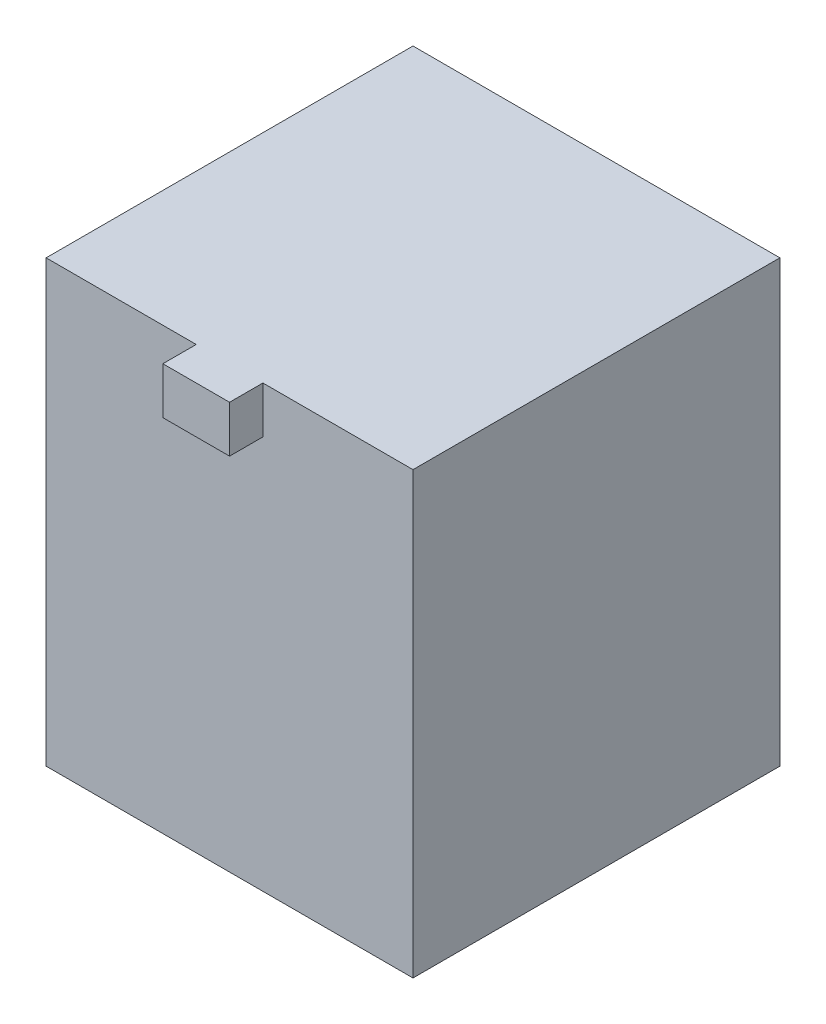
ISO-10303-21;
HEADER;
FILE_DESCRIPTION(('STEP AP214'),'2;1');
FILE_NAME('part.step','',(''),(''),'','','');
FILE_SCHEMA(('AUTOMOTIVE_DESIGN { 1 0 10303 214 1 1 1 1 }'));
ENDSEC;
DATA;
#1=APPLICATION_CONTEXT('core data for automotive mechanical design processes');
#2=APPLICATION_PROTOCOL_DEFINITION('international standard','automotive_design',2000,#1);
#3=PRODUCT_CONTEXT('',#1,'mechanical');
#4=PRODUCT('Part','Part','',(#3));
#5=PRODUCT_RELATED_PRODUCT_CATEGORY('part','',(#4));
#6=PRODUCT_DEFINITION_FORMATION('','',#4);
#7=PRODUCT_DEFINITION_CONTEXT('part definition',#1,'design');
#8=PRODUCT_DEFINITION('design','',#6,#7);
#9=PRODUCT_DEFINITION_SHAPE('','',#8);
#10=(LENGTH_UNIT() NAMED_UNIT(*) SI_UNIT(.MILLI.,.METRE.));
#11=(NAMED_UNIT(*) PLANE_ANGLE_UNIT() SI_UNIT($,.RADIAN.));
#12=(NAMED_UNIT(*) SI_UNIT($,.STERADIAN.) SOLID_ANGLE_UNIT());
#13=UNCERTAINTY_MEASURE_WITH_UNIT(LENGTH_MEASURE(1.E-05),#10,'distance_accuracy_value','');
#14=(GEOMETRIC_REPRESENTATION_CONTEXT(3) GLOBAL_UNCERTAINTY_ASSIGNED_CONTEXT((#13)) GLOBAL_UNIT_ASSIGNED_CONTEXT((#10,
#11,#12)) REPRESENTATION_CONTEXT('',''));
#15=CARTESIAN_POINT('',(0.,0.,0.));
#16=DIRECTION('',(0.,0.,1.));
#17=DIRECTION('',(1.,0.,0.));
#18=AXIS2_PLACEMENT_3D('',#15,#16,#17);
#19=CARTESIAN_POINT('',(-27.5,66.,27.5));
#20=DIRECTION('',(0.,0.,-1.));
#21=DIRECTION('',(-1.,0.,0.));
#22=AXIS2_PLACEMENT_3D('',#19,#20,#21);
#23=PLANE('',#22);
#24=DIRECTION('',(0.,1.,0.));
#25=VECTOR('',#24,1.);
#26=CARTESIAN_POINT('',(5.,66.,27.5));
#27=LINE('',#26,#25);
#28=CARTESIAN_POINT('',(5.,59.,27.5));
#29=VERTEX_POINT('',#28);
#30=CARTESIAN_POINT('',(5.,66.,27.5));
#31=VERTEX_POINT('',#30);
#32=EDGE_CURVE('E55',#29,#31,#27,.T.);
#33=ORIENTED_EDGE('',*,*,#32,.F.);
#34=DIRECTION('',(1.,0.,0.));
#35=VECTOR('',#34,1.);
#36=CARTESIAN_POINT('',(5.,59.,27.5));
#37=LINE('',#36,#35);
#38=CARTESIAN_POINT('',(-5.,59.,27.5));
#39=VERTEX_POINT('',#38);
#40=EDGE_CURVE('E124',#39,#29,#37,.T.);
#41=ORIENTED_EDGE('',*,*,#40,.F.);
#42=DIRECTION('',(0.,-1.,0.));
#43=VECTOR('',#42,1.);
#44=CARTESIAN_POINT('',(-5.,66.,27.5));
#45=LINE('',#44,#43);
#46=CARTESIAN_POINT('',(-5.,66.,27.5));
#47=VERTEX_POINT('',#46);
#48=EDGE_CURVE('E260',#47,#39,#45,.T.);
#49=ORIENTED_EDGE('',*,*,#48,.F.);
#50=DIRECTION('',(1.,0.,0.));
#51=VECTOR('',#50,1.);
#52=CARTESIAN_POINT('',(-27.5,66.,27.5));
#53=LINE('',#52,#51);
#54=CARTESIAN_POINT('',(-27.5,66.,27.5));
#55=VERTEX_POINT('',#54);
#56=EDGE_CURVE('E143',#55,#47,#53,.T.);
#57=ORIENTED_EDGE('',*,*,#56,.F.);
#58=DIRECTION('',(0.,-1.,0.));
#59=VECTOR('',#58,1.);
#60=CARTESIAN_POINT('',(-27.5,66.,27.5));
#61=LINE('',#60,#59);
#62=CARTESIAN_POINT('',(-27.5,0.,27.5));
#63=VERTEX_POINT('',#62);
#64=EDGE_CURVE('E152',#55,#63,#61,.T.);
#65=ORIENTED_EDGE('',*,*,#64,.T.);
#66=DIRECTION('',(1.,0.,0.));
#67=VECTOR('',#66,1.);
#68=CARTESIAN_POINT('',(-27.5,0.,27.5));
#69=LINE('',#68,#67);
#70=CARTESIAN_POINT('',(27.5,0.,27.5));
#71=VERTEX_POINT('',#70);
#72=EDGE_CURVE('E139',#63,#71,#69,.T.);
#73=ORIENTED_EDGE('',*,*,#72,.T.);
#74=DIRECTION('',(0.,-1.,0.));
#75=VECTOR('',#74,1.);
#76=CARTESIAN_POINT('',(27.5,66.,27.5));
#77=LINE('',#76,#75);
#78=CARTESIAN_POINT('',(27.5,66.,27.5));
#79=VERTEX_POINT('',#78);
#80=EDGE_CURVE('E144',#79,#71,#77,.T.);
#81=ORIENTED_EDGE('',*,*,#80,.F.);
#82=EDGE_CURVE('E60',#31,#79,#53,.T.);
#83=ORIENTED_EDGE('',*,*,#82,.F.);
#84=EDGE_LOOP('',(#33,#41,#49,#57,#65,#73,#81,#83));
#85=FACE_BOUND('',#84,.T.);
#86=ADVANCED_FACE('F40',(#85),#23,.F.);
#87=CARTESIAN_POINT('',(27.5,66.,27.5));
#88=DIRECTION('',(-1.,0.,0.));
#89=DIRECTION('',(0.,0.,1.));
#90=AXIS2_PLACEMENT_3D('',#87,#88,#89);
#91=PLANE('',#90);
#92=DIRECTION('',(0.,0.,-1.));
#93=VECTOR('',#92,1.);
#94=CARTESIAN_POINT('',(27.5,0.,27.5));
#95=LINE('',#94,#93);
#96=CARTESIAN_POINT('',(27.5,0.,-27.5));
#97=VERTEX_POINT('',#96);
#98=EDGE_CURVE('E127',#71,#97,#95,.T.);
#99=ORIENTED_EDGE('',*,*,#98,.T.);
#100=DIRECTION('',(0.,-1.,0.));
#101=VECTOR('',#100,1.);
#102=CARTESIAN_POINT('',(27.5,66.,-27.5));
#103=LINE('',#102,#101);
#104=CARTESIAN_POINT('',(27.5,66.,-27.5));
#105=VERTEX_POINT('',#104);
#106=EDGE_CURVE('E11',#105,#97,#103,.T.);
#107=ORIENTED_EDGE('',*,*,#106,.F.);
#108=DIRECTION('',(0.,0.,-1.));
#109=VECTOR('',#108,1.);
#110=CARTESIAN_POINT('',(27.5,66.,27.5));
#111=LINE('',#110,#109);
#112=EDGE_CURVE('E136',#79,#105,#111,.T.);
#113=ORIENTED_EDGE('',*,*,#112,.F.);
#114=ORIENTED_EDGE('',*,*,#80,.T.);
#115=EDGE_LOOP('',(#99,#107,#113,#114));
#116=FACE_BOUND('',#115,.T.);
#117=ADVANCED_FACE('F42',(#116),#91,.F.);
#118=CARTESIAN_POINT('',(-27.5,66.,-27.5));
#119=DIRECTION('',(0.,0.,1.));
#120=DIRECTION('',(1.,0.,0.));
#121=AXIS2_PLACEMENT_3D('',#118,#119,#120);
#122=PLANE('',#121);
#123=DIRECTION('',(-1.,0.,0.));
#124=VECTOR('',#123,1.);
#125=CARTESIAN_POINT('',(-27.5,0.,-27.5));
#126=LINE('',#125,#124);
#127=CARTESIAN_POINT('',(-27.5,0.,-27.5));
#128=VERTEX_POINT('',#127);
#129=EDGE_CURVE('E130',#97,#128,#126,.T.);
#130=ORIENTED_EDGE('',*,*,#129,.T.);
#131=DIRECTION('',(0.,-1.,0.));
#132=VECTOR('',#131,1.);
#133=CARTESIAN_POINT('',(-27.5,66.,-27.5));
#134=LINE('',#133,#132);
#135=CARTESIAN_POINT('',(-27.5,66.,-27.5));
#136=VERTEX_POINT('',#135);
#137=EDGE_CURVE('E48',#136,#128,#134,.T.);
#138=ORIENTED_EDGE('',*,*,#137,.F.);
#139=DIRECTION('',(-1.,0.,0.));
#140=VECTOR('',#139,1.);
#141=CARTESIAN_POINT('',(-27.5,66.,-27.5));
#142=LINE('',#141,#140);
#143=EDGE_CURVE('E138',#105,#136,#142,.T.);
#144=ORIENTED_EDGE('',*,*,#143,.F.);
#145=ORIENTED_EDGE('',*,*,#106,.T.);
#146=EDGE_LOOP('',(#130,#138,#144,#145));
#147=FACE_BOUND('',#146,.T.);
#148=ADVANCED_FACE('F170',(#147),#122,.F.);
#149=CARTESIAN_POINT('',(-27.5,66.,27.5));
#150=DIRECTION('',(1.,0.,0.));
#151=DIRECTION('',(0.,0.,-1.));
#152=AXIS2_PLACEMENT_3D('',#149,#150,#151);
#153=PLANE('',#152);
#154=DIRECTION('',(0.,0.,1.));
#155=VECTOR('',#154,1.);
#156=CARTESIAN_POINT('',(-27.5,0.,27.5));
#157=LINE('',#156,#155);
#158=EDGE_CURVE('E147',#128,#63,#157,.T.);
#159=ORIENTED_EDGE('',*,*,#158,.T.);
#160=ORIENTED_EDGE('',*,*,#64,.F.);
#161=DIRECTION('',(0.,0.,1.));
#162=VECTOR('',#161,1.);
#163=CARTESIAN_POINT('',(-27.5,66.,27.5));
#164=LINE('',#163,#162);
#165=EDGE_CURVE('E141',#136,#55,#164,.T.);
#166=ORIENTED_EDGE('',*,*,#165,.F.);
#167=ORIENTED_EDGE('',*,*,#137,.T.);
#168=EDGE_LOOP('',(#159,#160,#166,#167));
#169=FACE_BOUND('',#168,.T.);
#170=ADVANCED_FACE('F159',(#169),#153,.F.);
#171=CARTESIAN_POINT('',(0.,66.,0.));
#172=DIRECTION('',(0.,-1.,0.));
#173=DIRECTION('',(0.,0.,-1.));
#174=AXIS2_PLACEMENT_3D('',#171,#172,#173);
#175=PLANE('',#174);
#176=ORIENTED_EDGE('',*,*,#112,.T.);
#177=ORIENTED_EDGE('',*,*,#143,.T.);
#178=ORIENTED_EDGE('',*,*,#165,.T.);
#179=ORIENTED_EDGE('',*,*,#56,.T.);
#180=DIRECTION('',(0.,0.,-1.));
#181=VECTOR('',#180,1.);
#182=CARTESIAN_POINT('',(-5.,66.,32.5));
#183=LINE('',#182,#181);
#184=CARTESIAN_POINT('',(-5.,66.,32.5));
#185=VERTEX_POINT('',#184);
#186=EDGE_CURVE('E111',#185,#47,#183,.T.);
#187=ORIENTED_EDGE('',*,*,#186,.F.);
#188=DIRECTION('',(-1.,0.,0.));
#189=VECTOR('',#188,1.);
#190=CARTESIAN_POINT('',(-5.,66.,32.5));
#191=LINE('',#190,#189);
#192=CARTESIAN_POINT('',(5.,66.,32.5));
#193=VERTEX_POINT('',#192);
#194=EDGE_CURVE('E103',#193,#185,#191,.T.);
#195=ORIENTED_EDGE('',*,*,#194,.F.);
#196=DIRECTION('',(0.,0.,-1.));
#197=VECTOR('',#196,1.);
#198=CARTESIAN_POINT('',(5.,66.,32.5));
#199=LINE('',#198,#197);
#200=EDGE_CURVE('E108',#193,#31,#199,.T.);
#201=ORIENTED_EDGE('',*,*,#200,.T.);
#202=ORIENTED_EDGE('',*,*,#82,.T.);
#203=EDGE_LOOP('',(#176,#177,#178,#179,#187,#195,#201,#202));
#204=FACE_BOUND('',#203,.T.);
#205=ADVANCED_FACE('F106',(#204),#175,.F.);
#206=CARTESIAN_POINT('',(0.,0.,0.));
#207=DIRECTION('',(0.,-1.,0.));
#208=DIRECTION('',(0.,0.,-1.));
#209=AXIS2_PLACEMENT_3D('',#206,#207,#208);
#210=PLANE('',#209);
#211=ORIENTED_EDGE('',*,*,#98,.F.);
#212=ORIENTED_EDGE('',*,*,#72,.F.);
#213=ORIENTED_EDGE('',*,*,#158,.F.);
#214=ORIENTED_EDGE('',*,*,#129,.F.);
#215=EDGE_LOOP('',(#211,#212,#213,#214));
#216=FACE_BOUND('',#215,.T.);
#217=ADVANCED_FACE('F165',(#216),#210,.T.);
#218=CARTESIAN_POINT('',(5.,66.,32.5));
#219=DIRECTION('',(-1.,0.,0.));
#220=DIRECTION('',(0.,-1.,0.));
#221=AXIS2_PLACEMENT_3D('',#218,#219,#220);
#222=PLANE('',#221);
#223=ORIENTED_EDGE('',*,*,#32,.T.);
#224=ORIENTED_EDGE('',*,*,#200,.F.);
#225=DIRECTION('',(0.,1.,0.));
#226=VECTOR('',#225,1.);
#227=CARTESIAN_POINT('',(5.,66.,32.5));
#228=LINE('',#227,#226);
#229=CARTESIAN_POINT('',(5.,59.,32.5));
#230=VERTEX_POINT('',#229);
#231=EDGE_CURVE('E115',#230,#193,#228,.T.);
#232=ORIENTED_EDGE('',*,*,#231,.F.);
#233=DIRECTION('',(0.,0.,-1.));
#234=VECTOR('',#233,1.);
#235=CARTESIAN_POINT('',(5.,59.,32.5));
#236=LINE('',#235,#234);
#237=EDGE_CURVE('E257',#230,#29,#236,.T.);
#238=ORIENTED_EDGE('',*,*,#237,.T.);
#239=EDGE_LOOP('',(#223,#224,#232,#238));
#240=FACE_BOUND('',#239,.T.);
#241=ADVANCED_FACE('F126',(#240),#222,.F.);
#242=CARTESIAN_POINT('',(-5.,66.,32.5));
#243=DIRECTION('',(1.,0.,0.));
#244=DIRECTION('',(0.,1.,0.));
#245=AXIS2_PLACEMENT_3D('',#242,#243,#244);
#246=PLANE('',#245);
#247=ORIENTED_EDGE('',*,*,#48,.T.);
#248=DIRECTION('',(0.,0.,-1.));
#249=VECTOR('',#248,1.);
#250=CARTESIAN_POINT('',(-5.,59.,32.5));
#251=LINE('',#250,#249);
#252=CARTESIAN_POINT('',(-5.,59.,32.5));
#253=VERTEX_POINT('',#252);
#254=EDGE_CURVE('E132',#253,#39,#251,.T.);
#255=ORIENTED_EDGE('',*,*,#254,.F.);
#256=DIRECTION('',(0.,-1.,0.));
#257=VECTOR('',#256,1.);
#258=CARTESIAN_POINT('',(-5.,66.,32.5));
#259=LINE('',#258,#257);
#260=EDGE_CURVE('E114',#185,#253,#259,.T.);
#261=ORIENTED_EDGE('',*,*,#260,.F.);
#262=ORIENTED_EDGE('',*,*,#186,.T.);
#263=EDGE_LOOP('',(#247,#255,#261,#262));
#264=FACE_BOUND('',#263,.T.);
#265=ADVANCED_FACE('F188',(#264),#246,.F.);
#266=CARTESIAN_POINT('',(5.,59.,32.5));
#267=DIRECTION('',(0.,1.,0.));
#268=DIRECTION('',(0.,0.,1.));
#269=AXIS2_PLACEMENT_3D('',#266,#267,#268);
#270=PLANE('',#269);
#271=ORIENTED_EDGE('',*,*,#40,.T.);
#272=ORIENTED_EDGE('',*,*,#237,.F.);
#273=DIRECTION('',(1.,0.,0.));
#274=VECTOR('',#273,1.);
#275=CARTESIAN_POINT('',(5.,59.,32.5));
#276=LINE('',#275,#274);
#277=EDGE_CURVE('E120',#253,#230,#276,.T.);
#278=ORIENTED_EDGE('',*,*,#277,.F.);
#279=ORIENTED_EDGE('',*,*,#254,.T.);
#280=EDGE_LOOP('',(#271,#272,#278,#279));
#281=FACE_BOUND('',#280,.T.);
#282=ADVANCED_FACE('F191',(#281),#270,.F.);
#283=CARTESIAN_POINT('',(0.,0.,32.5));
#284=DIRECTION('',(0.,0.,-1.));
#285=DIRECTION('',(-1.,0.,0.));
#286=AXIS2_PLACEMENT_3D('',#283,#284,#285);
#287=PLANE('',#286);
#288=ORIENTED_EDGE('',*,*,#231,.T.);
#289=ORIENTED_EDGE('',*,*,#194,.T.);
#290=ORIENTED_EDGE('',*,*,#260,.T.);
#291=ORIENTED_EDGE('',*,*,#277,.T.);
#292=EDGE_LOOP('',(#288,#289,#290,#291));
#293=FACE_BOUND('',#292,.T.);
#294=ADVANCED_FACE('F118',(#293),#287,.F.);
#295=CLOSED_SHELL('',(#86,#117,#148,#170,#205,#217,#241,#265,#282,#294));
#296=MANIFOLD_SOLID_BREP('B2',#295);
#297=ADVANCED_BREP_SHAPE_REPRESENTATION('',(#18,#296),#14);
#298=SHAPE_DEFINITION_REPRESENTATION(#9,#297);
ENDSEC;
END-ISO-10303-21;
